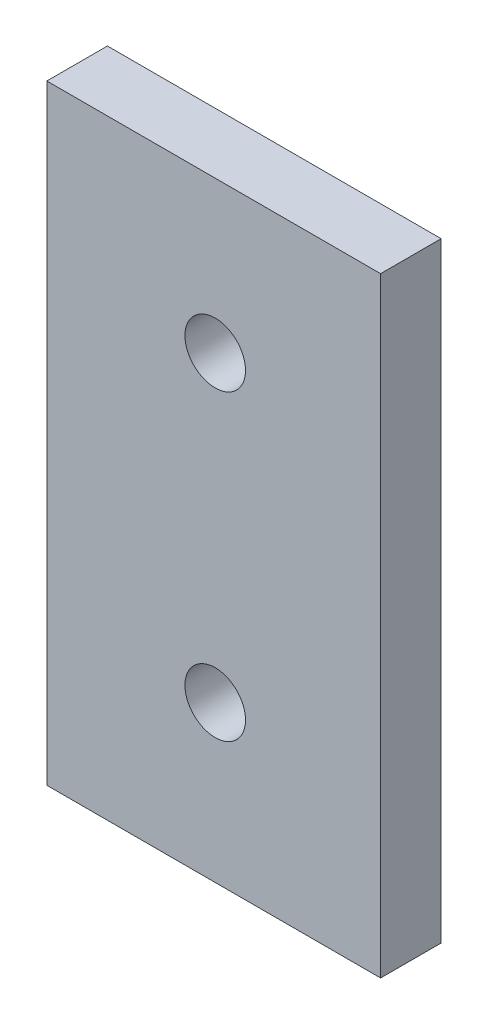
ISO-10303-21;
HEADER;
FILE_DESCRIPTION(('STEP AP214'),'2;1');
FILE_NAME('part.step','',(''),(''),'','','');
FILE_SCHEMA(('AUTOMOTIVE_DESIGN { 1 0 10303 214 1 1 1 1 }'));
ENDSEC;
DATA;
#1=APPLICATION_CONTEXT('core data for automotive mechanical design processes');
#2=APPLICATION_PROTOCOL_DEFINITION('international standard','automotive_design',2000,#1);
#3=PRODUCT_CONTEXT('',#1,'mechanical');
#4=PRODUCT('Part','Part','',(#3));
#5=PRODUCT_RELATED_PRODUCT_CATEGORY('part','',(#4));
#6=PRODUCT_DEFINITION_FORMATION('','',#4);
#7=PRODUCT_DEFINITION_CONTEXT('part definition',#1,'design');
#8=PRODUCT_DEFINITION('design','',#6,#7);
#9=PRODUCT_DEFINITION_SHAPE('','',#8);
#10=(LENGTH_UNIT() NAMED_UNIT(*) SI_UNIT(.MILLI.,.METRE.));
#11=(NAMED_UNIT(*) PLANE_ANGLE_UNIT() SI_UNIT($,.RADIAN.));
#12=(NAMED_UNIT(*) SI_UNIT($,.STERADIAN.) SOLID_ANGLE_UNIT());
#13=UNCERTAINTY_MEASURE_WITH_UNIT(LENGTH_MEASURE(1.E-05),#10,'distance_accuracy_value','');
#14=(GEOMETRIC_REPRESENTATION_CONTEXT(3) GLOBAL_UNCERTAINTY_ASSIGNED_CONTEXT((#13)) GLOBAL_UNIT_ASSIGNED_CONTEXT((#10,
#11,#12)) REPRESENTATION_CONTEXT('',''));
#15=CARTESIAN_POINT('',(0.,0.,0.));
#16=DIRECTION('',(0.,0.,1.));
#17=DIRECTION('',(1.,0.,0.));
#18=AXIS2_PLACEMENT_3D('',#15,#16,#17);
#19=CARTESIAN_POINT('',(0.,0.,2.));
#20=DIRECTION('',(0.,0.,1.));
#21=DIRECTION('',(1.,0.,0.));
#22=AXIS2_PLACEMENT_3D('',#19,#20,#21);
#23=PLANE('',#22);
#24=CARTESIAN_POINT('',(5.56,15.1450688563843,2.));
#25=DIRECTION('',(0.,0.,1.));
#26=DIRECTION('',(1.,0.,0.));
#27=AXIS2_PLACEMENT_3D('',#24,#25,#26);
#28=CIRCLE('',#27,0.999999999999998);
#29=CARTESIAN_POINT('',(6.56,15.1450688563843,2.));
#30=VERTEX_POINT('',#29);
#31=EDGE_CURVE('E101',#30,#30,#28,.T.);
#32=ORIENTED_EDGE('',*,*,#31,.F.);
#33=EDGE_LOOP('',(#32));
#34=FACE_BOUND('',#33,.T.);
#35=DIRECTION('',(0.,-1.,0.));
#36=VECTOR('',#35,1.);
#37=CARTESIAN_POINT('',(0.,20.1450688563843,2.));
#38=LINE('',#37,#36);
#39=CARTESIAN_POINT('',(0.,20.1450688563843,2.));
#40=VERTEX_POINT('',#39);
#41=CARTESIAN_POINT('',(0.,0.,2.));
#42=VERTEX_POINT('',#41);
#43=EDGE_CURVE('E86',#40,#42,#38,.T.);
#44=ORIENTED_EDGE('',*,*,#43,.T.);
#45=DIRECTION('',(1.,0.,0.));
#46=VECTOR('',#45,1.);
#47=CARTESIAN_POINT('',(0.,0.,2.));
#48=LINE('',#47,#46);
#49=CARTESIAN_POINT('',(11.0216446783139,0.,2.));
#50=VERTEX_POINT('',#49);
#51=EDGE_CURVE('E81',#42,#50,#48,.T.);
#52=ORIENTED_EDGE('',*,*,#51,.T.);
#53=DIRECTION('',(0.,1.,0.));
#54=VECTOR('',#53,1.);
#55=CARTESIAN_POINT('',(11.0216446783139,20.1450688563843,2.));
#56=LINE('',#55,#54);
#57=CARTESIAN_POINT('',(11.0216446783139,20.1450688563843,2.));
#58=VERTEX_POINT('',#57);
#59=EDGE_CURVE('E84',#50,#58,#56,.T.);
#60=ORIENTED_EDGE('',*,*,#59,.T.);
#61=DIRECTION('',(-1.,0.,0.));
#62=VECTOR('',#61,1.);
#63=CARTESIAN_POINT('',(0.,20.1450688563843,2.));
#64=LINE('',#63,#62);
#65=EDGE_CURVE('E51',#58,#40,#64,.T.);
#66=ORIENTED_EDGE('',*,*,#65,.T.);
#67=EDGE_LOOP('',(#44,#52,#60,#66));
#68=FACE_BOUND('',#67,.T.);
#69=CARTESIAN_POINT('',(5.56,5.1450688563843,2.));
#70=DIRECTION('',(0.,0.,1.));
#71=DIRECTION('',(1.,0.,0.));
#72=AXIS2_PLACEMENT_3D('',#69,#70,#71);
#73=CIRCLE('',#72,1.);
#74=CARTESIAN_POINT('',(6.56,5.1450688563843,2.));
#75=VERTEX_POINT('',#74);
#76=EDGE_CURVE('E116',#75,#75,#73,.T.);
#77=ORIENTED_EDGE('',*,*,#76,.F.);
#78=EDGE_LOOP('',(#77));
#79=FACE_BOUND('',#78,.T.);
#80=ADVANCED_FACE('F34',(#34,#68,#79),#23,.T.);
#81=CARTESIAN_POINT('',(0.,0.,0.));
#82=DIRECTION('',(0.,0.,1.));
#83=DIRECTION('',(1.,0.,0.));
#84=AXIS2_PLACEMENT_3D('',#81,#82,#83);
#85=PLANE('',#84);
#86=DIRECTION('',(0.,-1.,0.));
#87=VECTOR('',#86,1.);
#88=CARTESIAN_POINT('',(0.,20.1450688563843,0.));
#89=LINE('',#88,#87);
#90=CARTESIAN_POINT('',(0.,20.1450688563843,0.));
#91=VERTEX_POINT('',#90);
#92=CARTESIAN_POINT('',(0.,0.,0.));
#93=VERTEX_POINT('',#92);
#94=EDGE_CURVE('E98',#91,#93,#89,.T.);
#95=ORIENTED_EDGE('',*,*,#94,.F.);
#96=DIRECTION('',(-1.,0.,0.));
#97=VECTOR('',#96,1.);
#98=CARTESIAN_POINT('',(0.,20.1450688563843,0.));
#99=LINE('',#98,#97);
#100=CARTESIAN_POINT('',(11.0216446783139,20.1450688563843,0.));
#101=VERTEX_POINT('',#100);
#102=EDGE_CURVE('E74',#101,#91,#99,.T.);
#103=ORIENTED_EDGE('',*,*,#102,.F.);
#104=DIRECTION('',(0.,1.,0.));
#105=VECTOR('',#104,1.);
#106=CARTESIAN_POINT('',(11.0216446783139,20.1450688563843,0.));
#107=LINE('',#106,#105);
#108=CARTESIAN_POINT('',(11.0216446783139,0.,0.));
#109=VERTEX_POINT('',#108);
#110=EDGE_CURVE('E68',#109,#101,#107,.T.);
#111=ORIENTED_EDGE('',*,*,#110,.F.);
#112=DIRECTION('',(1.,0.,0.));
#113=VECTOR('',#112,1.);
#114=CARTESIAN_POINT('',(0.,0.,0.));
#115=LINE('',#114,#113);
#116=EDGE_CURVE('E90',#93,#109,#115,.T.);
#117=ORIENTED_EDGE('',*,*,#116,.F.);
#118=EDGE_LOOP('',(#95,#103,#111,#117));
#119=FACE_BOUND('',#118,.T.);
#120=CARTESIAN_POINT('',(5.56,15.1450688563843,0.));
#121=DIRECTION('',(0.,0.,1.));
#122=DIRECTION('',(1.,0.,0.));
#123=AXIS2_PLACEMENT_3D('',#120,#121,#122);
#124=CIRCLE('',#123,0.999999999999998);
#125=CARTESIAN_POINT('',(6.56,15.1450688563843,0.));
#126=VERTEX_POINT('',#125);
#127=EDGE_CURVE('E113',#126,#126,#124,.T.);
#128=ORIENTED_EDGE('',*,*,#127,.T.);
#129=EDGE_LOOP('',(#128));
#130=FACE_BOUND('',#129,.T.);
#131=CARTESIAN_POINT('',(5.56,5.1450688563843,0.));
#132=DIRECTION('',(0.,0.,1.));
#133=DIRECTION('',(1.,0.,0.));
#134=AXIS2_PLACEMENT_3D('',#131,#132,#133);
#135=CIRCLE('',#134,1.);
#136=CARTESIAN_POINT('',(6.56,5.1450688563843,0.));
#137=VERTEX_POINT('',#136);
#138=EDGE_CURVE('E119',#137,#137,#135,.T.);
#139=ORIENTED_EDGE('',*,*,#138,.T.);
#140=EDGE_LOOP('',(#139));
#141=FACE_BOUND('',#140,.T.);
#142=ADVANCED_FACE('F109',(#119,#130,#141),#85,.F.);
#143=CARTESIAN_POINT('',(0.,20.1450688563843,2.));
#144=DIRECTION('',(1.,0.,0.));
#145=DIRECTION('',(0.,1.,0.));
#146=AXIS2_PLACEMENT_3D('',#143,#144,#145);
#147=PLANE('',#146);
#148=ORIENTED_EDGE('',*,*,#94,.T.);
#149=DIRECTION('',(0.,0.,-1.));
#150=VECTOR('',#149,1.);
#151=CARTESIAN_POINT('',(0.,0.,2.));
#152=LINE('',#151,#150);
#153=EDGE_CURVE('E11',#42,#93,#152,.T.);
#154=ORIENTED_EDGE('',*,*,#153,.F.);
#155=ORIENTED_EDGE('',*,*,#43,.F.);
#156=DIRECTION('',(0.,0.,-1.));
#157=VECTOR('',#156,1.);
#158=CARTESIAN_POINT('',(0.,20.1450688563843,2.));
#159=LINE('',#158,#157);
#160=EDGE_CURVE('E94',#40,#91,#159,.T.);
#161=ORIENTED_EDGE('',*,*,#160,.T.);
#162=EDGE_LOOP('',(#148,#154,#155,#161));
#163=FACE_BOUND('',#162,.T.);
#164=ADVANCED_FACE('F36',(#163),#147,.F.);
#165=CARTESIAN_POINT('',(0.,0.,2.));
#166=DIRECTION('',(0.,1.,0.));
#167=DIRECTION('',(0.,0.,1.));
#168=AXIS2_PLACEMENT_3D('',#165,#166,#167);
#169=PLANE('',#168);
#170=ORIENTED_EDGE('',*,*,#116,.T.);
#171=DIRECTION('',(0.,0.,-1.));
#172=VECTOR('',#171,1.);
#173=CARTESIAN_POINT('',(11.0216446783139,0.,2.));
#174=LINE('',#173,#172);
#175=EDGE_CURVE('E43',#50,#109,#174,.T.);
#176=ORIENTED_EDGE('',*,*,#175,.F.);
#177=ORIENTED_EDGE('',*,*,#51,.F.);
#178=ORIENTED_EDGE('',*,*,#153,.T.);
#179=EDGE_LOOP('',(#170,#176,#177,#178));
#180=FACE_BOUND('',#179,.T.);
#181=ADVANCED_FACE('F89',(#180),#169,.F.);
#182=CARTESIAN_POINT('',(11.0216446783139,20.1450688563843,2.));
#183=DIRECTION('',(-1.,0.,0.));
#184=DIRECTION('',(0.,0.,1.));
#185=AXIS2_PLACEMENT_3D('',#182,#183,#184);
#186=PLANE('',#185);
#187=ORIENTED_EDGE('',*,*,#110,.T.);
#188=DIRECTION('',(0.,0.,-1.));
#189=VECTOR('',#188,1.);
#190=CARTESIAN_POINT('',(11.0216446783139,20.1450688563843,2.));
#191=LINE('',#190,#189);
#192=EDGE_CURVE('E91',#58,#101,#191,.T.);
#193=ORIENTED_EDGE('',*,*,#192,.F.);
#194=ORIENTED_EDGE('',*,*,#59,.F.);
#195=ORIENTED_EDGE('',*,*,#175,.T.);
#196=EDGE_LOOP('',(#187,#193,#194,#195));
#197=FACE_BOUND('',#196,.T.);
#198=ADVANCED_FACE('F92',(#197),#186,.F.);
#199=CARTESIAN_POINT('',(0.,20.1450688563843,2.));
#200=DIRECTION('',(0.,-1.,0.));
#201=DIRECTION('',(0.,0.,-1.));
#202=AXIS2_PLACEMENT_3D('',#199,#200,#201);
#203=PLANE('',#202);
#204=ORIENTED_EDGE('',*,*,#102,.T.);
#205=ORIENTED_EDGE('',*,*,#160,.F.);
#206=ORIENTED_EDGE('',*,*,#65,.F.);
#207=ORIENTED_EDGE('',*,*,#192,.T.);
#208=EDGE_LOOP('',(#204,#205,#206,#207));
#209=FACE_BOUND('',#208,.T.);
#210=ADVANCED_FACE('F106',(#209),#203,.F.);
#211=CARTESIAN_POINT('',(5.56,15.1450688563843,2.));
#212=DIRECTION('',(0.,0.,-1.));
#213=DIRECTION('',(-1.,0.,0.));
#214=AXIS2_PLACEMENT_3D('',#211,#212,#213);
#215=CYLINDRICAL_SURFACE('',#214,0.999999999999998);
#216=ORIENTED_EDGE('',*,*,#31,.T.);
#217=EDGE_LOOP('',(#216));
#218=FACE_BOUND('',#217,.T.);
#219=ORIENTED_EDGE('',*,*,#127,.F.);
#220=EDGE_LOOP('',(#219));
#221=FACE_BOUND('',#220,.T.);
#222=ADVANCED_FACE('F136',(#218,#221),#215,.F.);
#223=CARTESIAN_POINT('',(5.56,5.1450688563843,2.));
#224=DIRECTION('',(0.,0.,-1.));
#225=DIRECTION('',(-1.,0.,0.));
#226=AXIS2_PLACEMENT_3D('',#223,#224,#225);
#227=CYLINDRICAL_SURFACE('',#226,1.);
#228=ORIENTED_EDGE('',*,*,#76,.T.);
#229=EDGE_LOOP('',(#228));
#230=FACE_BOUND('',#229,.T.);
#231=ORIENTED_EDGE('',*,*,#138,.F.);
#232=EDGE_LOOP('',(#231));
#233=FACE_BOUND('',#232,.T.);
#234=ADVANCED_FACE('F125',(#230,#233),#227,.F.);
#235=CLOSED_SHELL('',(#80,#142,#164,#181,#198,#210,#222,#234));
#236=MANIFOLD_SOLID_BREP('B2',#235);
#237=ADVANCED_BREP_SHAPE_REPRESENTATION('',(#18,#236),#14);
#238=SHAPE_DEFINITION_REPRESENTATION(#9,#237);
ENDSEC;
END-ISO-10303-21;
